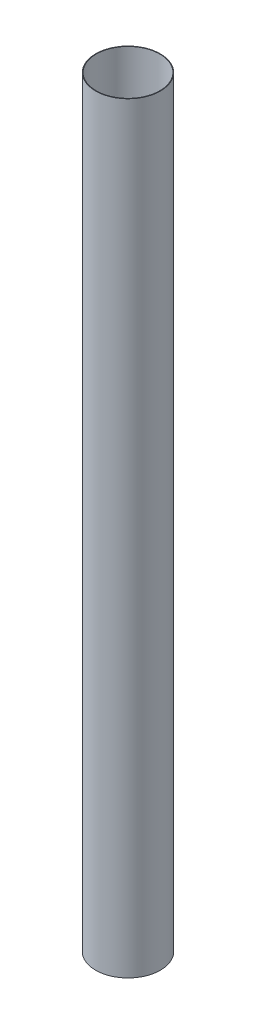
ISO-10303-21;
HEADER;
FILE_DESCRIPTION(('STEP AP214'),'2;1');
FILE_NAME('part.step','',(''),(''),'','','');
FILE_SCHEMA(('AUTOMOTIVE_DESIGN { 1 0 10303 214 1 1 1 1 }'));
ENDSEC;
DATA;
#1=APPLICATION_CONTEXT('core data for automotive mechanical design processes');
#2=APPLICATION_PROTOCOL_DEFINITION('international standard','automotive_design',2000,#1);
#3=PRODUCT_CONTEXT('',#1,'mechanical');
#4=PRODUCT('Part','Part','',(#3));
#5=PRODUCT_RELATED_PRODUCT_CATEGORY('part','',(#4));
#6=PRODUCT_DEFINITION_FORMATION('','',#4);
#7=PRODUCT_DEFINITION_CONTEXT('part definition',#1,'design');
#8=PRODUCT_DEFINITION('design','',#6,#7);
#9=PRODUCT_DEFINITION_SHAPE('','',#8);
#10=(LENGTH_UNIT() NAMED_UNIT(*) SI_UNIT(.MILLI.,.METRE.));
#11=(NAMED_UNIT(*) PLANE_ANGLE_UNIT() SI_UNIT($,.RADIAN.));
#12=(NAMED_UNIT(*) SI_UNIT($,.STERADIAN.) SOLID_ANGLE_UNIT());
#13=UNCERTAINTY_MEASURE_WITH_UNIT(LENGTH_MEASURE(1.E-05),#10,'distance_accuracy_value','');
#14=(GEOMETRIC_REPRESENTATION_CONTEXT(3) GLOBAL_UNCERTAINTY_ASSIGNED_CONTEXT((#13)) GLOBAL_UNIT_ASSIGNED_CONTEXT((#10,
#11,#12)) REPRESENTATION_CONTEXT('',''));
#15=CARTESIAN_POINT('',(0.,0.,0.));
#16=DIRECTION('',(0.,0.,1.));
#17=DIRECTION('',(1.,0.,0.));
#18=AXIS2_PLACEMENT_3D('',#15,#16,#17);
#19=CARTESIAN_POINT('',(0.,718.,0.));
#20=DIRECTION('',(0.,1.,0.));
#21=DIRECTION('',(0.,0.,1.));
#22=AXIS2_PLACEMENT_3D('',#19,#20,#21);
#23=PLANE('',#22);
#24=CARTESIAN_POINT('',(0.,718.,0.));
#25=DIRECTION('',(0.,1.,0.));
#26=DIRECTION('',(0.,0.,1.));
#27=AXIS2_PLACEMENT_3D('',#24,#25,#26);
#28=CIRCLE('',#27,30.5);
#29=CARTESIAN_POINT('',(0.,718.,30.5));
#30=VERTEX_POINT('',#29);
#31=EDGE_CURVE('E10',#30,#30,#28,.T.);
#32=ORIENTED_EDGE('',*,*,#31,.T.);
#33=EDGE_LOOP('',(#32));
#34=FACE_BOUND('',#33,.T.);
#35=CARTESIAN_POINT('',(0.,718.,0.));
#36=DIRECTION('',(0.,1.,0.));
#37=DIRECTION('',(0.,0.,1.));
#38=AXIS2_PLACEMENT_3D('',#35,#36,#37);
#39=CIRCLE('',#38,30.);
#40=CARTESIAN_POINT('',(0.,718.,30.));
#41=VERTEX_POINT('',#40);
#42=EDGE_CURVE('E47',#41,#41,#39,.T.);
#43=ORIENTED_EDGE('',*,*,#42,.F.);
#44=EDGE_LOOP('',(#43));
#45=FACE_BOUND('',#44,.T.);
#46=ADVANCED_FACE('F36',(#34,#45),#23,.T.);
#47=CARTESIAN_POINT('',(0.,0.,0.));
#48=DIRECTION('',(0.,1.,0.));
#49=DIRECTION('',(0.,0.,1.));
#50=AXIS2_PLACEMENT_3D('',#47,#48,#49);
#51=PLANE('',#50);
#52=CARTESIAN_POINT('',(0.,0.,0.));
#53=DIRECTION('',(0.,1.,0.));
#54=DIRECTION('',(0.,0.,1.));
#55=AXIS2_PLACEMENT_3D('',#52,#53,#54);
#56=CIRCLE('',#55,30.5);
#57=CARTESIAN_POINT('',(0.,0.,30.5));
#58=VERTEX_POINT('',#57);
#59=EDGE_CURVE('E40',#58,#58,#56,.T.);
#60=ORIENTED_EDGE('',*,*,#59,.F.);
#61=EDGE_LOOP('',(#60));
#62=FACE_BOUND('',#61,.T.);
#63=CARTESIAN_POINT('',(0.,0.,0.));
#64=DIRECTION('',(0.,1.,0.));
#65=DIRECTION('',(0.,0.,1.));
#66=AXIS2_PLACEMENT_3D('',#63,#64,#65);
#67=CIRCLE('',#66,30.);
#68=CARTESIAN_POINT('',(0.,0.,30.));
#69=VERTEX_POINT('',#68);
#70=EDGE_CURVE('E49',#69,#69,#67,.T.);
#71=ORIENTED_EDGE('',*,*,#70,.T.);
#72=EDGE_LOOP('',(#71));
#73=FACE_BOUND('',#72,.T.);
#74=ADVANCED_FACE('F59',(#62,#73),#51,.F.);
#75=CARTESIAN_POINT('',(0.,718.,0.));
#76=DIRECTION('',(0.,-1.,0.));
#77=DIRECTION('',(0.,0.,-1.));
#78=AXIS2_PLACEMENT_3D('',#75,#76,#77);
#79=CYLINDRICAL_SURFACE('',#78,30.5);
#80=ORIENTED_EDGE('',*,*,#31,.F.);
#81=EDGE_LOOP('',(#80));
#82=FACE_BOUND('',#81,.T.);
#83=ORIENTED_EDGE('',*,*,#59,.T.);
#84=EDGE_LOOP('',(#83));
#85=FACE_BOUND('',#84,.T.);
#86=ADVANCED_FACE('F38',(#82,#85),#79,.T.);
#87=CARTESIAN_POINT('',(0.,718.,0.));
#88=DIRECTION('',(0.,-1.,0.));
#89=DIRECTION('',(0.,0.,-1.));
#90=AXIS2_PLACEMENT_3D('',#87,#88,#89);
#91=CYLINDRICAL_SURFACE('',#90,30.);
#92=ORIENTED_EDGE('',*,*,#42,.T.);
#93=EDGE_LOOP('',(#92));
#94=FACE_BOUND('',#93,.T.);
#95=ORIENTED_EDGE('',*,*,#70,.F.);
#96=EDGE_LOOP('',(#95));
#97=FACE_BOUND('',#96,.T.);
#98=ADVANCED_FACE('F55',(#94,#97),#91,.F.);
#99=CLOSED_SHELL('',(#46,#74,#86,#98));
#100=MANIFOLD_SOLID_BREP('B2',#99);
#101=ADVANCED_BREP_SHAPE_REPRESENTATION('',(#18,#100),#14);
#102=SHAPE_DEFINITION_REPRESENTATION(#9,#101);
ENDSEC;
END-ISO-10303-21;
